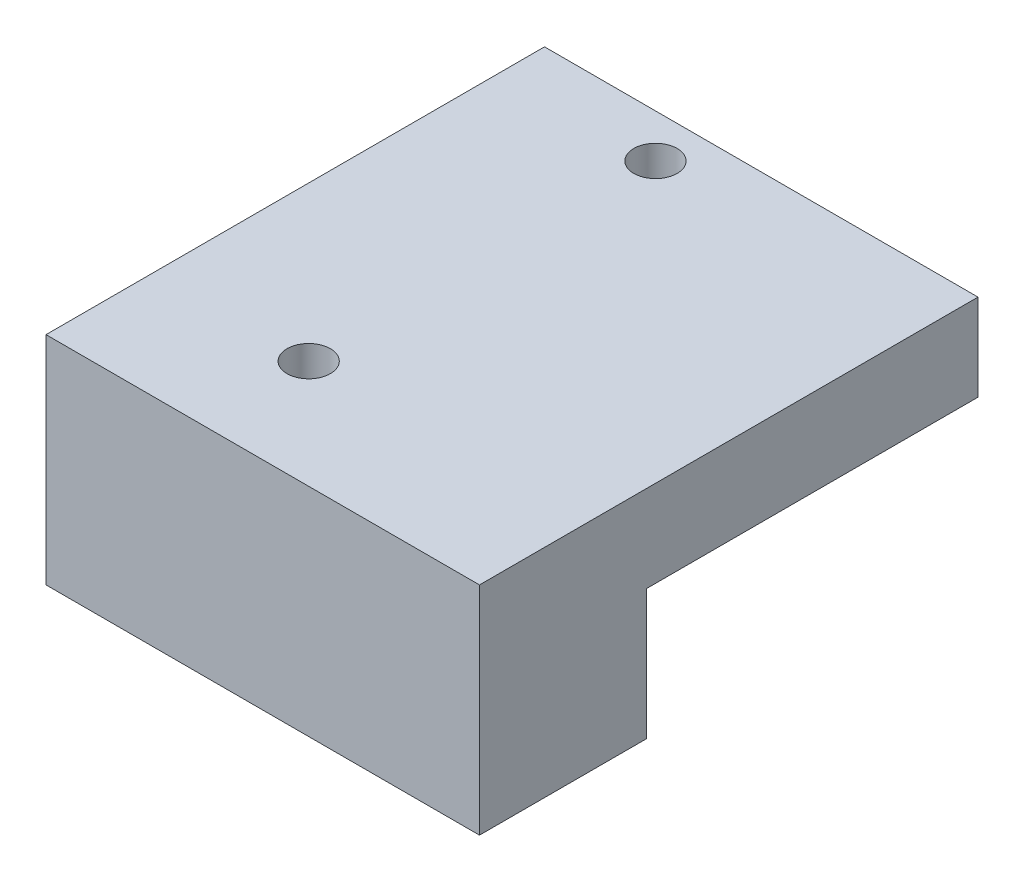
ISO-10303-21;
HEADER;
FILE_DESCRIPTION(('STEP AP214'),'2;1');
FILE_NAME('part.step','',(''),(''),'','','');
FILE_SCHEMA(('AUTOMOTIVE_DESIGN { 1 0 10303 214 1 1 1 1 }'));
ENDSEC;
DATA;
#1=APPLICATION_CONTEXT('core data for automotive mechanical design processes');
#2=APPLICATION_PROTOCOL_DEFINITION('international standard','automotive_design',2000,#1);
#3=PRODUCT_CONTEXT('',#1,'mechanical');
#4=PRODUCT('Part','Part','',(#3));
#5=PRODUCT_RELATED_PRODUCT_CATEGORY('part','',(#4));
#6=PRODUCT_DEFINITION_FORMATION('','',#4);
#7=PRODUCT_DEFINITION_CONTEXT('part definition',#1,'design');
#8=PRODUCT_DEFINITION('design','',#6,#7);
#9=PRODUCT_DEFINITION_SHAPE('','',#8);
#10=(LENGTH_UNIT() NAMED_UNIT(*) SI_UNIT(.MILLI.,.METRE.));
#11=(NAMED_UNIT(*) PLANE_ANGLE_UNIT() SI_UNIT($,.RADIAN.));
#12=(NAMED_UNIT(*) SI_UNIT($,.STERADIAN.) SOLID_ANGLE_UNIT());
#13=UNCERTAINTY_MEASURE_WITH_UNIT(LENGTH_MEASURE(1.E-05),#10,'distance_accuracy_value','');
#14=(GEOMETRIC_REPRESENTATION_CONTEXT(3) GLOBAL_UNCERTAINTY_ASSIGNED_CONTEXT((#13)) GLOBAL_UNIT_ASSIGNED_CONTEXT((#10,
#11,#12)) REPRESENTATION_CONTEXT('',''));
#15=CARTESIAN_POINT('',(0.,0.,0.));
#16=DIRECTION('',(0.,0.,1.));
#17=DIRECTION('',(1.,0.,0.));
#18=AXIS2_PLACEMENT_3D('',#15,#16,#17);
#19=CARTESIAN_POINT('',(10.,10.,-11.5));
#20=DIRECTION('',(0.,0.,1.));
#21=DIRECTION('',(1.,0.,0.));
#22=AXIS2_PLACEMENT_3D('',#19,#20,#21);
#23=PLANE('',#22);
#24=DIRECTION('',(1.,0.,0.));
#25=VECTOR('',#24,1.);
#26=CARTESIAN_POINT('',(5.,6.,-11.5));
#27=LINE('',#26,#25);
#28=CARTESIAN_POINT('',(7.,6.,-11.5));
#29=VERTEX_POINT('',#28);
#30=CARTESIAN_POINT('',(10.,6.,-11.5));
#31=VERTEX_POINT('',#30);
#32=EDGE_CURVE('E160',#29,#31,#27,.T.);
#33=ORIENTED_EDGE('',*,*,#32,.F.);
#34=DIRECTION('',(0.,-1.,0.));
#35=VECTOR('',#34,1.);
#36=CARTESIAN_POINT('',(7.,7.,-11.5));
#37=LINE('',#36,#35);
#38=CARTESIAN_POINT('',(7.,7.,-11.5));
#39=VERTEX_POINT('',#38);
#40=EDGE_CURVE('E247',#39,#29,#37,.T.);
#41=ORIENTED_EDGE('',*,*,#40,.F.);
#42=DIRECTION('',(1.,0.,0.));
#43=VECTOR('',#42,1.);
#44=CARTESIAN_POINT('',(0.,7.,-11.5));
#45=LINE('',#44,#43);
#46=CARTESIAN_POINT('',(-7.,7.,-11.5));
#47=VERTEX_POINT('',#46);
#48=EDGE_CURVE('E234',#47,#39,#45,.T.);
#49=ORIENTED_EDGE('',*,*,#48,.F.);
#50=DIRECTION('',(0.,-1.,0.));
#51=VECTOR('',#50,1.);
#52=CARTESIAN_POINT('',(-7.,7.,-11.5));
#53=LINE('',#52,#51);
#54=CARTESIAN_POINT('',(-7.,0.,-11.5));
#55=VERTEX_POINT('',#54);
#56=EDGE_CURVE('E257',#47,#55,#53,.T.);
#57=ORIENTED_EDGE('',*,*,#56,.T.);
#58=DIRECTION('',(-1.,0.,0.));
#59=VECTOR('',#58,1.);
#60=CARTESIAN_POINT('',(10.,0.,-11.5));
#61=LINE('',#60,#59);
#62=CARTESIAN_POINT('',(-10.,0.,-11.5));
#63=VERTEX_POINT('',#62);
#64=EDGE_CURVE('E268',#55,#63,#61,.T.);
#65=ORIENTED_EDGE('',*,*,#64,.T.);
#66=DIRECTION('',(0.,-1.,0.));
#67=VECTOR('',#66,1.);
#68=CARTESIAN_POINT('',(-10.,10.,-11.5));
#69=LINE('',#68,#67);
#70=CARTESIAN_POINT('',(-10.,10.,-11.5));
#71=VERTEX_POINT('',#70);
#72=EDGE_CURVE('E179',#71,#63,#69,.T.);
#73=ORIENTED_EDGE('',*,*,#72,.F.);
#74=DIRECTION('',(-1.,0.,0.));
#75=VECTOR('',#74,1.);
#76=CARTESIAN_POINT('',(10.,10.,-11.5));
#77=LINE('',#76,#75);
#78=CARTESIAN_POINT('',(10.,10.,-11.5));
#79=VERTEX_POINT('',#78);
#80=EDGE_CURVE('E178',#79,#71,#77,.T.);
#81=ORIENTED_EDGE('',*,*,#80,.F.);
#82=DIRECTION('',(0.,-1.,0.));
#83=VECTOR('',#82,1.);
#84=CARTESIAN_POINT('',(10.,10.,-11.5));
#85=LINE('',#84,#83);
#86=EDGE_CURVE('E173',#79,#31,#85,.T.);
#87=ORIENTED_EDGE('',*,*,#86,.T.);
#88=EDGE_LOOP('',(#33,#41,#49,#57,#65,#73,#81,#87));
#89=FACE_BOUND('',#88,.T.);
#90=ADVANCED_FACE('F44',(#89),#23,.F.);
#91=CARTESIAN_POINT('',(0.,0.,0.));
#92=DIRECTION('',(0.,1.,0.));
#93=DIRECTION('',(0.,0.,1.));
#94=AXIS2_PLACEMENT_3D('',#91,#92,#93);
#95=PLANE('',#94);
#96=DIRECTION('',(0.,0.,-1.));
#97=VECTOR('',#96,1.);
#98=CARTESIAN_POINT('',(-8.5,0.,5.775));
#99=LINE('',#98,#97);
#100=CARTESIAN_POINT('',(-8.5,0.,-6.05));
#101=VERTEX_POINT('',#100);
#102=CARTESIAN_POINT('',(-8.5,0.,-8.775));
#103=VERTEX_POINT('',#102);
#104=EDGE_CURVE('E294',#101,#103,#99,.T.);
#105=ORIENTED_EDGE('',*,*,#104,.F.);
#106=DIRECTION('',(-1.,0.,0.));
#107=VECTOR('',#106,1.);
#108=CARTESIAN_POINT('',(-3.,0.,-6.05));
#109=LINE('',#108,#107);
#110=CARTESIAN_POINT('',(-10.,0.,-6.05));
#111=VERTEX_POINT('',#110);
#112=EDGE_CURVE('E233',#101,#111,#109,.T.);
#113=ORIENTED_EDGE('',*,*,#112,.T.);
#114=DIRECTION('',(0.,0.,1.));
#115=VECTOR('',#114,1.);
#116=CARTESIAN_POINT('',(-10.,0.,11.5));
#117=LINE('',#116,#115);
#118=EDGE_CURVE('E273',#63,#111,#117,.T.);
#119=ORIENTED_EDGE('',*,*,#118,.F.);
#120=ORIENTED_EDGE('',*,*,#64,.F.);
#121=DIRECTION('',(0.,0.,-1.));
#122=VECTOR('',#121,1.);
#123=CARTESIAN_POINT('',(-7.,0.,-11.5));
#124=LINE('',#123,#122);
#125=CARTESIAN_POINT('',(-7.,0.,-8.775));
#126=VERTEX_POINT('',#125);
#127=EDGE_CURVE('E254',#126,#55,#124,.T.);
#128=ORIENTED_EDGE('',*,*,#127,.F.);
#129=DIRECTION('',(1.,0.,0.));
#130=VECTOR('',#129,1.);
#131=CARTESIAN_POINT('',(-8.5,0.,-8.775));
#132=LINE('',#131,#130);
#133=EDGE_CURVE('E222',#103,#126,#132,.T.);
#134=ORIENTED_EDGE('',*,*,#133,.F.);
#135=EDGE_LOOP('',(#105,#113,#119,#120,#128,#134));
#136=FACE_BOUND('',#135,.T.);
#137=ADVANCED_FACE('F292',(#136),#95,.F.);
#138=CARTESIAN_POINT('',(-7.,7.,-11.5));
#139=DIRECTION('',(-1.,0.,0.));
#140=DIRECTION('',(0.,0.,1.));
#141=AXIS2_PLACEMENT_3D('',#138,#139,#140);
#142=PLANE('',#141);
#143=DIRECTION('',(0.,1.,0.));
#144=VECTOR('',#143,1.);
#145=CARTESIAN_POINT('',(-7.,0.,-8.775));
#146=LINE('',#145,#144);
#147=CARTESIAN_POINT('',(-7.,7.,-8.775));
#148=VERTEX_POINT('',#147);
#149=EDGE_CURVE('E197',#126,#148,#146,.T.);
#150=ORIENTED_EDGE('',*,*,#149,.F.);
#151=ORIENTED_EDGE('',*,*,#127,.T.);
#152=ORIENTED_EDGE('',*,*,#56,.F.);
#153=DIRECTION('',(0.,0.,-1.));
#154=VECTOR('',#153,1.);
#155=CARTESIAN_POINT('',(-7.,7.,-11.5));
#156=LINE('',#155,#154);
#157=EDGE_CURVE('E242',#148,#47,#156,.T.);
#158=ORIENTED_EDGE('',*,*,#157,.F.);
#159=EDGE_LOOP('',(#150,#151,#152,#158));
#160=FACE_BOUND('',#159,.T.);
#161=ADVANCED_FACE('F325',(#160),#142,.F.);
#162=CARTESIAN_POINT('',(-3.,0.,-1.5));
#163=DIRECTION('',(-1.,0.,0.));
#164=DIRECTION('',(0.,0.,1.));
#165=AXIS2_PLACEMENT_3D('',#162,#163,#164);
#166=CYLINDRICAL_SURFACE('',#165,4.55);
#167=CARTESIAN_POINT('',(-8.5,0.,-1.5));
#168=DIRECTION('',(1.,0.,0.));
#169=DIRECTION('',(0.,0.,-1.));
#170=AXIS2_PLACEMENT_3D('',#167,#168,#169);
#171=CIRCLE('',#170,4.55);
#172=CARTESIAN_POINT('',(-8.5,0.,3.05));
#173=VERTEX_POINT('',#172);
#174=EDGE_CURVE('E192',#173,#101,#171,.F.);
#175=ORIENTED_EDGE('',*,*,#174,.F.);
#176=DIRECTION('',(-1.,0.,0.));
#177=VECTOR('',#176,1.);
#178=CARTESIAN_POINT('',(-3.,0.,3.05));
#179=LINE('',#178,#177);
#180=CARTESIAN_POINT('',(-10.,0.,3.05));
#181=VERTEX_POINT('',#180);
#182=EDGE_CURVE('E226',#181,#173,#179,.F.);
#183=ORIENTED_EDGE('',*,*,#182,.F.);
#184=CARTESIAN_POINT('',(-10.,0.,-1.5));
#185=DIRECTION('',(-1.,0.,0.));
#186=DIRECTION('',(0.,0.,1.));
#187=AXIS2_PLACEMENT_3D('',#184,#185,#186);
#188=CIRCLE('',#187,4.55);
#189=EDGE_CURVE('E223',#181,#111,#188,.T.);
#190=ORIENTED_EDGE('',*,*,#189,.T.);
#191=ORIENTED_EDGE('',*,*,#112,.F.);
#192=EDGE_LOOP('',(#175,#183,#190,#191));
#193=FACE_BOUND('',#192,.T.);
#194=ADVANCED_FACE('F300',(#193),#166,.F.);
#195=CARTESIAN_POINT('',(-10.,10.,11.5));
#196=DIRECTION('',(1.,0.,0.));
#197=DIRECTION('',(0.,0.,-1.));
#198=AXIS2_PLACEMENT_3D('',#195,#196,#197);
#199=PLANE('',#198);
#200=ORIENTED_EDGE('',*,*,#189,.F.);
#201=CARTESIAN_POINT('',(-10.,0.,11.5));
#202=VERTEX_POINT('',#201);
#203=EDGE_CURVE('E256',#181,#202,#117,.T.);
#204=ORIENTED_EDGE('',*,*,#203,.T.);
#205=DIRECTION('',(0.,-1.,0.));
#206=VECTOR('',#205,1.);
#207=CARTESIAN_POINT('',(-10.,10.,11.5));
#208=LINE('',#207,#206);
#209=CARTESIAN_POINT('',(-10.,10.,11.5));
#210=VERTEX_POINT('',#209);
#211=EDGE_CURVE('E182',#210,#202,#208,.T.);
#212=ORIENTED_EDGE('',*,*,#211,.F.);
#213=DIRECTION('',(0.,0.,1.));
#214=VECTOR('',#213,1.);
#215=CARTESIAN_POINT('',(-10.,10.,11.5));
#216=LINE('',#215,#214);
#217=EDGE_CURVE('E267',#71,#210,#216,.T.);
#218=ORIENTED_EDGE('',*,*,#217,.F.);
#219=ORIENTED_EDGE('',*,*,#72,.T.);
#220=ORIENTED_EDGE('',*,*,#118,.T.);
#221=EDGE_LOOP('',(#200,#204,#212,#218,#219,#220));
#222=FACE_BOUND('',#221,.T.);
#223=ADVANCED_FACE('F50',(#222),#199,.F.);
#224=DIRECTION('',(0.,0.,1.));
#225=VECTOR('',#224,1.);
#226=CARTESIAN_POINT('',(7.,0.,8.5));
#227=LINE('',#226,#225);
#228=CARTESIAN_POINT('',(7.,0.,3.8));
#229=VERTEX_POINT('',#228);
#230=CARTESIAN_POINT('',(7.,0.,8.5));
#231=VERTEX_POINT('',#230);
#232=EDGE_CURVE('E231',#229,#231,#227,.T.);
#233=ORIENTED_EDGE('',*,*,#232,.F.);
#234=DIRECTION('',(1.,0.,0.));
#235=VECTOR('',#234,1.);
#236=CARTESIAN_POINT('',(5.,0.,3.8));
#237=LINE('',#236,#235);
#238=CARTESIAN_POINT('',(10.,0.,3.8));
#239=VERTEX_POINT('',#238);
#240=EDGE_CURVE('E398',#229,#239,#237,.T.);
#241=ORIENTED_EDGE('',*,*,#240,.T.);
#242=DIRECTION('',(0.,0.,-1.));
#243=VECTOR('',#242,1.);
#244=CARTESIAN_POINT('',(10.,0.,11.5));
#245=LINE('',#244,#243);
#246=CARTESIAN_POINT('',(10.,0.,11.5));
#247=VERTEX_POINT('',#246);
#248=EDGE_CURVE('E278',#247,#239,#245,.T.);
#249=ORIENTED_EDGE('',*,*,#248,.F.);
#250=DIRECTION('',(1.,0.,0.));
#251=VECTOR('',#250,1.);
#252=CARTESIAN_POINT('',(10.,0.,11.5));
#253=LINE('',#252,#251);
#254=EDGE_CURVE('E279',#202,#247,#253,.T.);
#255=ORIENTED_EDGE('',*,*,#254,.F.);
#256=ORIENTED_EDGE('',*,*,#203,.F.);
#257=ORIENTED_EDGE('',*,*,#182,.T.);
#258=CARTESIAN_POINT('',(-8.5,0.,5.775));
#259=VERTEX_POINT('',#258);
#260=EDGE_CURVE('E66',#259,#173,#99,.T.);
#261=ORIENTED_EDGE('',*,*,#260,.F.);
#262=DIRECTION('',(1.,0.,0.));
#263=VECTOR('',#262,1.);
#264=CARTESIAN_POINT('',(-8.5,0.,5.775));
#265=LINE('',#264,#263);
#266=CARTESIAN_POINT('',(-7.,0.,5.775));
#267=VERTEX_POINT('',#266);
#268=EDGE_CURVE('E216',#259,#267,#265,.T.);
#269=ORIENTED_EDGE('',*,*,#268,.T.);
#270=CARTESIAN_POINT('',(-7.,0.,8.5));
#271=VERTEX_POINT('',#270);
#272=EDGE_CURVE('E238',#271,#267,#124,.T.);
#273=ORIENTED_EDGE('',*,*,#272,.F.);
#274=DIRECTION('',(-1.,0.,0.));
#275=VECTOR('',#274,1.);
#276=CARTESIAN_POINT('',(-7.,0.,8.5));
#277=LINE('',#276,#275);
#278=EDGE_CURVE('E249',#231,#271,#277,.T.);
#279=ORIENTED_EDGE('',*,*,#278,.F.);
#280=EDGE_LOOP('',(#233,#241,#249,#255,#256,#257,#261,#269,#273,#279));
#281=FACE_BOUND('',#280,.T.);
#282=ADVANCED_FACE('F305',(#281),#95,.F.);
#283=CARTESIAN_POINT('',(10.,10.,11.5));
#284=DIRECTION('',(0.,0.,-1.));
#285=DIRECTION('',(-1.,0.,0.));
#286=AXIS2_PLACEMENT_3D('',#283,#284,#285);
#287=PLANE('',#286);
#288=ORIENTED_EDGE('',*,*,#254,.T.);
#289=DIRECTION('',(0.,-1.,0.));
#290=VECTOR('',#289,1.);
#291=CARTESIAN_POINT('',(10.,10.,11.5));
#292=LINE('',#291,#290);
#293=CARTESIAN_POINT('',(10.,10.,11.5));
#294=VERTEX_POINT('',#293);
#295=EDGE_CURVE('E177',#294,#247,#292,.T.);
#296=ORIENTED_EDGE('',*,*,#295,.F.);
#297=DIRECTION('',(1.,0.,0.));
#298=VECTOR('',#297,1.);
#299=CARTESIAN_POINT('',(10.,10.,11.5));
#300=LINE('',#299,#298);
#301=EDGE_CURVE('E266',#210,#294,#300,.T.);
#302=ORIENTED_EDGE('',*,*,#301,.F.);
#303=ORIENTED_EDGE('',*,*,#211,.T.);
#304=EDGE_LOOP('',(#288,#296,#302,#303));
#305=FACE_BOUND('',#304,.T.);
#306=ADVANCED_FACE('F310',(#305),#287,.F.);
#307=CARTESIAN_POINT('',(10.,10.,11.5));
#308=DIRECTION('',(-1.,0.,0.));
#309=DIRECTION('',(0.,0.,1.));
#310=AXIS2_PLACEMENT_3D('',#307,#308,#309);
#311=PLANE('',#310);
#312=DIRECTION('',(0.,-1.,0.));
#313=VECTOR('',#312,1.);
#314=CARTESIAN_POINT('',(10.,6.,3.8));
#315=LINE('',#314,#313);
#316=CARTESIAN_POINT('',(10.,6.,3.8));
#317=VERTEX_POINT('',#316);
#318=EDGE_CURVE('E170',#317,#239,#315,.T.);
#319=ORIENTED_EDGE('',*,*,#318,.F.);
#320=DIRECTION('',(0.,0.,-1.));
#321=VECTOR('',#320,1.);
#322=CARTESIAN_POINT('',(10.,6.,3.8));
#323=LINE('',#322,#321);
#324=EDGE_CURVE('E158',#317,#31,#323,.T.);
#325=ORIENTED_EDGE('',*,*,#324,.T.);
#326=ORIENTED_EDGE('',*,*,#86,.F.);
#327=DIRECTION('',(0.,0.,-1.));
#328=VECTOR('',#327,1.);
#329=CARTESIAN_POINT('',(10.,10.,11.5));
#330=LINE('',#329,#328);
#331=EDGE_CURVE('E275',#294,#79,#330,.T.);
#332=ORIENTED_EDGE('',*,*,#331,.F.);
#333=ORIENTED_EDGE('',*,*,#295,.T.);
#334=ORIENTED_EDGE('',*,*,#248,.T.);
#335=EDGE_LOOP('',(#319,#325,#326,#332,#333,#334));
#336=FACE_BOUND('',#335,.T.);
#337=ADVANCED_FACE('F171',(#336),#311,.F.);
#338=CARTESIAN_POINT('',(0.,10.,0.));
#339=DIRECTION('',(0.,1.,0.));
#340=DIRECTION('',(0.,0.,1.));
#341=AXIS2_PLACEMENT_3D('',#338,#339,#340);
#342=PLANE('',#341);
#343=CARTESIAN_POINT('',(-2.88,10.,-9.50000000000001));
#344=DIRECTION('',(0.,1.,0.));
#345=DIRECTION('',(0.,0.,1.));
#346=AXIS2_PLACEMENT_3D('',#343,#344,#345);
#347=CIRCLE('',#346,1.);
#348=CARTESIAN_POINT('',(-2.88,10.,-8.5));
#349=VERTEX_POINT('',#348);
#350=EDGE_CURVE('E200',#349,#349,#347,.T.);
#351=ORIENTED_EDGE('',*,*,#350,.F.);
#352=EDGE_LOOP('',(#351));
#353=FACE_BOUND('',#352,.T.);
#354=CARTESIAN_POINT('',(-2.87999999999999,10.,6.5));
#355=DIRECTION('',(0.,1.,0.));
#356=DIRECTION('',(0.,0.,1.));
#357=AXIS2_PLACEMENT_3D('',#354,#355,#356);
#358=CIRCLE('',#357,1.);
#359=CARTESIAN_POINT('',(-2.87999999999999,10.,7.5));
#360=VERTEX_POINT('',#359);
#361=EDGE_CURVE('E400',#360,#360,#358,.T.);
#362=ORIENTED_EDGE('',*,*,#361,.F.);
#363=EDGE_LOOP('',(#362));
#364=FACE_BOUND('',#363,.T.);
#365=ORIENTED_EDGE('',*,*,#217,.T.);
#366=ORIENTED_EDGE('',*,*,#301,.T.);
#367=ORIENTED_EDGE('',*,*,#331,.T.);
#368=ORIENTED_EDGE('',*,*,#80,.T.);
#369=EDGE_LOOP('',(#365,#366,#367,#368));
#370=FACE_BOUND('',#369,.T.);
#371=ADVANCED_FACE('F307',(#353,#364,#370),#342,.T.);
#372=ORIENTED_EDGE('',*,*,#272,.T.);
#373=DIRECTION('',(0.,1.,0.));
#374=VECTOR('',#373,1.);
#375=CARTESIAN_POINT('',(-7.,0.,5.775));
#376=LINE('',#375,#374);
#377=CARTESIAN_POINT('',(-7.,7.,5.775));
#378=VERTEX_POINT('',#377);
#379=EDGE_CURVE('E204',#267,#378,#376,.T.);
#380=ORIENTED_EDGE('',*,*,#379,.T.);
#381=CARTESIAN_POINT('',(-7.,7.,8.5));
#382=VERTEX_POINT('',#381);
#383=EDGE_CURVE('E244',#382,#378,#156,.T.);
#384=ORIENTED_EDGE('',*,*,#383,.F.);
#385=DIRECTION('',(0.,-1.,0.));
#386=VECTOR('',#385,1.);
#387=CARTESIAN_POINT('',(-7.,7.,8.5));
#388=LINE('',#387,#386);
#389=EDGE_CURVE('E258',#382,#271,#388,.T.);
#390=ORIENTED_EDGE('',*,*,#389,.T.);
#391=EDGE_LOOP('',(#372,#380,#384,#390));
#392=FACE_BOUND('',#391,.T.);
#393=ADVANCED_FACE('F311',(#392),#142,.F.);
#394=CARTESIAN_POINT('',(-7.,7.,8.5));
#395=DIRECTION('',(0.,0.,1.));
#396=DIRECTION('',(1.,0.,0.));
#397=AXIS2_PLACEMENT_3D('',#394,#395,#396);
#398=PLANE('',#397);
#399=ORIENTED_EDGE('',*,*,#278,.T.);
#400=ORIENTED_EDGE('',*,*,#389,.F.);
#401=DIRECTION('',(-1.,0.,0.));
#402=VECTOR('',#401,1.);
#403=CARTESIAN_POINT('',(-7.,7.,8.5));
#404=LINE('',#403,#402);
#405=CARTESIAN_POINT('',(7.,7.,8.5));
#406=VERTEX_POINT('',#405);
#407=EDGE_CURVE('E241',#406,#382,#404,.T.);
#408=ORIENTED_EDGE('',*,*,#407,.F.);
#409=DIRECTION('',(0.,-1.,0.));
#410=VECTOR('',#409,1.);
#411=CARTESIAN_POINT('',(7.,7.,8.5));
#412=LINE('',#411,#410);
#413=EDGE_CURVE('E265',#406,#231,#412,.T.);
#414=ORIENTED_EDGE('',*,*,#413,.T.);
#415=EDGE_LOOP('',(#399,#400,#408,#414));
#416=FACE_BOUND('',#415,.T.);
#417=ADVANCED_FACE('F316',(#416),#398,.F.);
#418=CARTESIAN_POINT('',(7.,7.,8.5));
#419=DIRECTION('',(1.,0.,0.));
#420=DIRECTION('',(0.,0.,-1.));
#421=AXIS2_PLACEMENT_3D('',#418,#419,#420);
#422=PLANE('',#421);
#423=DIRECTION('',(0.,0.,-1.));
#424=VECTOR('',#423,1.);
#425=CARTESIAN_POINT('',(7.,6.,8.5));
#426=LINE('',#425,#424);
#427=CARTESIAN_POINT('',(7.,6.,3.8));
#428=VERTEX_POINT('',#427);
#429=EDGE_CURVE('E52',#428,#29,#426,.T.);
#430=ORIENTED_EDGE('',*,*,#429,.F.);
#431=DIRECTION('',(0.,-1.,0.));
#432=VECTOR('',#431,1.);
#433=CARTESIAN_POINT('',(7.,7.,3.8));
#434=LINE('',#433,#432);
#435=EDGE_CURVE('E11',#428,#229,#434,.T.);
#436=ORIENTED_EDGE('',*,*,#435,.T.);
#437=ORIENTED_EDGE('',*,*,#232,.T.);
#438=ORIENTED_EDGE('',*,*,#413,.F.);
#439=DIRECTION('',(0.,0.,1.));
#440=VECTOR('',#439,1.);
#441=CARTESIAN_POINT('',(7.,7.,8.5));
#442=LINE('',#441,#440);
#443=EDGE_CURVE('E240',#39,#406,#442,.T.);
#444=ORIENTED_EDGE('',*,*,#443,.F.);
#445=ORIENTED_EDGE('',*,*,#40,.T.);
#446=EDGE_LOOP('',(#430,#436,#437,#438,#444,#445));
#447=FACE_BOUND('',#446,.T.);
#448=ADVANCED_FACE('F357',(#447),#422,.F.);
#449=CARTESIAN_POINT('',(0.,7.,0.));
#450=DIRECTION('',(0.,1.,0.));
#451=DIRECTION('',(0.,0.,1.));
#452=AXIS2_PLACEMENT_3D('',#449,#450,#451);
#453=PLANE('',#452);
#454=CARTESIAN_POINT('',(-2.88,7.,-9.50000000000001));
#455=DIRECTION('',(0.,1.,0.));
#456=DIRECTION('',(0.,0.,1.));
#457=AXIS2_PLACEMENT_3D('',#454,#455,#456);
#458=CIRCLE('',#457,1.);
#459=CARTESIAN_POINT('',(-2.88,7.,-8.5));
#460=VERTEX_POINT('',#459);
#461=EDGE_CURVE('E198',#460,#460,#458,.T.);
#462=ORIENTED_EDGE('',*,*,#461,.T.);
#463=EDGE_LOOP('',(#462));
#464=FACE_BOUND('',#463,.T.);
#465=CARTESIAN_POINT('',(-2.87999999999999,7.,6.5));
#466=DIRECTION('',(0.,1.,0.));
#467=DIRECTION('',(0.,0.,1.));
#468=AXIS2_PLACEMENT_3D('',#465,#466,#467);
#469=CIRCLE('',#468,1.);
#470=CARTESIAN_POINT('',(-2.87999999999999,7.,7.5));
#471=VERTEX_POINT('',#470);
#472=EDGE_CURVE('E194',#471,#471,#469,.T.);
#473=ORIENTED_EDGE('',*,*,#472,.T.);
#474=EDGE_LOOP('',(#473));
#475=FACE_BOUND('',#474,.T.);
#476=ORIENTED_EDGE('',*,*,#48,.T.);
#477=ORIENTED_EDGE('',*,*,#443,.T.);
#478=ORIENTED_EDGE('',*,*,#407,.T.);
#479=ORIENTED_EDGE('',*,*,#383,.T.);
#480=DIRECTION('',(1.,0.,0.));
#481=VECTOR('',#480,1.);
#482=CARTESIAN_POINT('',(-8.5,7.,5.775));
#483=LINE('',#482,#481);
#484=CARTESIAN_POINT('',(-8.5,7.,5.775));
#485=VERTEX_POINT('',#484);
#486=EDGE_CURVE('E218',#485,#378,#483,.T.);
#487=ORIENTED_EDGE('',*,*,#486,.F.);
#488=DIRECTION('',(0.,0.,-1.));
#489=VECTOR('',#488,1.);
#490=CARTESIAN_POINT('',(-8.5,7.,5.775));
#491=LINE('',#490,#489);
#492=CARTESIAN_POINT('',(-8.5,7.,-8.775));
#493=VERTEX_POINT('',#492);
#494=EDGE_CURVE('E208',#485,#493,#491,.T.);
#495=ORIENTED_EDGE('',*,*,#494,.T.);
#496=DIRECTION('',(1.,0.,0.));
#497=VECTOR('',#496,1.);
#498=CARTESIAN_POINT('',(-8.5,7.,-8.775));
#499=LINE('',#498,#497);
#500=EDGE_CURVE('E224',#493,#148,#499,.T.);
#501=ORIENTED_EDGE('',*,*,#500,.T.);
#502=ORIENTED_EDGE('',*,*,#157,.T.);
#503=EDGE_LOOP('',(#476,#477,#478,#479,#487,#495,#501,#502));
#504=FACE_BOUND('',#503,.T.);
#505=ADVANCED_FACE('F353',(#464,#475,#504),#453,.F.);
#506=CARTESIAN_POINT('',(-8.5,0.,0.));
#507=DIRECTION('',(1.,0.,0.));
#508=DIRECTION('',(0.,0.,-1.));
#509=AXIS2_PLACEMENT_3D('',#506,#507,#508);
#510=PLANE('',#509);
#511=ORIENTED_EDGE('',*,*,#174,.T.);
#512=ORIENTED_EDGE('',*,*,#104,.T.);
#513=DIRECTION('',(0.,1.,0.));
#514=VECTOR('',#513,1.);
#515=CARTESIAN_POINT('',(-8.5,0.,-8.775));
#516=LINE('',#515,#514);
#517=EDGE_CURVE('E368',#103,#493,#516,.T.);
#518=ORIENTED_EDGE('',*,*,#517,.T.);
#519=ORIENTED_EDGE('',*,*,#494,.F.);
#520=DIRECTION('',(0.,1.,0.));
#521=VECTOR('',#520,1.);
#522=CARTESIAN_POINT('',(-8.5,0.,5.775));
#523=LINE('',#522,#521);
#524=EDGE_CURVE('E214',#259,#485,#523,.T.);
#525=ORIENTED_EDGE('',*,*,#524,.F.);
#526=ORIENTED_EDGE('',*,*,#260,.T.);
#527=EDGE_LOOP('',(#511,#512,#518,#519,#525,#526));
#528=FACE_BOUND('',#527,.T.);
#529=ADVANCED_FACE('F358',(#528),#510,.T.);
#530=CARTESIAN_POINT('',(-8.5,0.,-8.775));
#531=DIRECTION('',(0.,0.,-1.));
#532=DIRECTION('',(-1.,0.,0.));
#533=AXIS2_PLACEMENT_3D('',#530,#531,#532);
#534=PLANE('',#533);
#535=ORIENTED_EDGE('',*,*,#149,.T.);
#536=ORIENTED_EDGE('',*,*,#500,.F.);
#537=ORIENTED_EDGE('',*,*,#517,.F.);
#538=ORIENTED_EDGE('',*,*,#133,.T.);
#539=EDGE_LOOP('',(#535,#536,#537,#538));
#540=FACE_BOUND('',#539,.T.);
#541=ADVANCED_FACE('F354',(#540),#534,.F.);
#542=CARTESIAN_POINT('',(-8.5,0.,5.775));
#543=DIRECTION('',(0.,0.,-1.));
#544=DIRECTION('',(-1.,0.,0.));
#545=AXIS2_PLACEMENT_3D('',#542,#543,#544);
#546=PLANE('',#545);
#547=ORIENTED_EDGE('',*,*,#379,.F.);
#548=ORIENTED_EDGE('',*,*,#268,.F.);
#549=ORIENTED_EDGE('',*,*,#524,.T.);
#550=ORIENTED_EDGE('',*,*,#486,.T.);
#551=EDGE_LOOP('',(#547,#548,#549,#550));
#552=FACE_BOUND('',#551,.T.);
#553=ADVANCED_FACE('F374',(#552),#546,.T.);
#554=CARTESIAN_POINT('',(-2.87999999999999,5.,6.5));
#555=DIRECTION('',(0.,1.,0.));
#556=DIRECTION('',(0.,0.,1.));
#557=AXIS2_PLACEMENT_3D('',#554,#555,#556);
#558=CYLINDRICAL_SURFACE('',#557,1.);
#559=ORIENTED_EDGE('',*,*,#361,.T.);
#560=EDGE_LOOP('',(#559));
#561=FACE_BOUND('',#560,.T.);
#562=ORIENTED_EDGE('',*,*,#472,.F.);
#563=EDGE_LOOP('',(#562));
#564=FACE_BOUND('',#563,.T.);
#565=ADVANCED_FACE('F384',(#561,#564),#558,.F.);
#566=CARTESIAN_POINT('',(-2.88,5.,-9.50000000000001));
#567=DIRECTION('',(0.,1.,0.));
#568=DIRECTION('',(0.,0.,1.));
#569=AXIS2_PLACEMENT_3D('',#566,#567,#568);
#570=CYLINDRICAL_SURFACE('',#569,1.);
#571=ORIENTED_EDGE('',*,*,#350,.T.);
#572=EDGE_LOOP('',(#571));
#573=FACE_BOUND('',#572,.T.);
#574=ORIENTED_EDGE('',*,*,#461,.F.);
#575=EDGE_LOOP('',(#574));
#576=FACE_BOUND('',#575,.T.);
#577=ADVANCED_FACE('F389',(#573,#576),#570,.F.);
#578=CARTESIAN_POINT('',(5.,6.,3.8));
#579=DIRECTION('',(0.,0.,1.));
#580=DIRECTION('',(1.,0.,0.));
#581=AXIS2_PLACEMENT_3D('',#578,#579,#580);
#582=PLANE('',#581);
#583=DIRECTION('',(1.,0.,0.));
#584=VECTOR('',#583,1.);
#585=CARTESIAN_POINT('',(5.,6.,3.8));
#586=LINE('',#585,#584);
#587=EDGE_CURVE('E58',#428,#317,#586,.T.);
#588=ORIENTED_EDGE('',*,*,#587,.T.);
#589=ORIENTED_EDGE('',*,*,#318,.T.);
#590=ORIENTED_EDGE('',*,*,#240,.F.);
#591=ORIENTED_EDGE('',*,*,#435,.F.);
#592=EDGE_LOOP('',(#588,#589,#590,#591));
#593=FACE_BOUND('',#592,.T.);
#594=ADVANCED_FACE('F395',(#593),#582,.F.);
#595=CARTESIAN_POINT('',(5.,6.,3.8));
#596=DIRECTION('',(0.,-1.,0.));
#597=DIRECTION('',(0.,0.,-1.));
#598=AXIS2_PLACEMENT_3D('',#595,#596,#597);
#599=PLANE('',#598);
#600=ORIENTED_EDGE('',*,*,#429,.T.);
#601=ORIENTED_EDGE('',*,*,#32,.T.);
#602=ORIENTED_EDGE('',*,*,#324,.F.);
#603=ORIENTED_EDGE('',*,*,#587,.F.);
#604=EDGE_LOOP('',(#600,#601,#602,#603));
#605=FACE_BOUND('',#604,.T.);
#606=ADVANCED_FACE('F156',(#605),#599,.T.);
#607=CLOSED_SHELL('',(#90,#137,#161,#194,#223,#282,#306,#337,#371,#393,#417,#448,#505,#529,#541,
#553,#565,#577,#594,#606));
#608=MANIFOLD_SOLID_BREP('B2',#607);
#609=ADVANCED_BREP_SHAPE_REPRESENTATION('',(#18,#608),#14);
#610=SHAPE_DEFINITION_REPRESENTATION(#9,#609);
ENDSEC;
END-ISO-10303-21;
